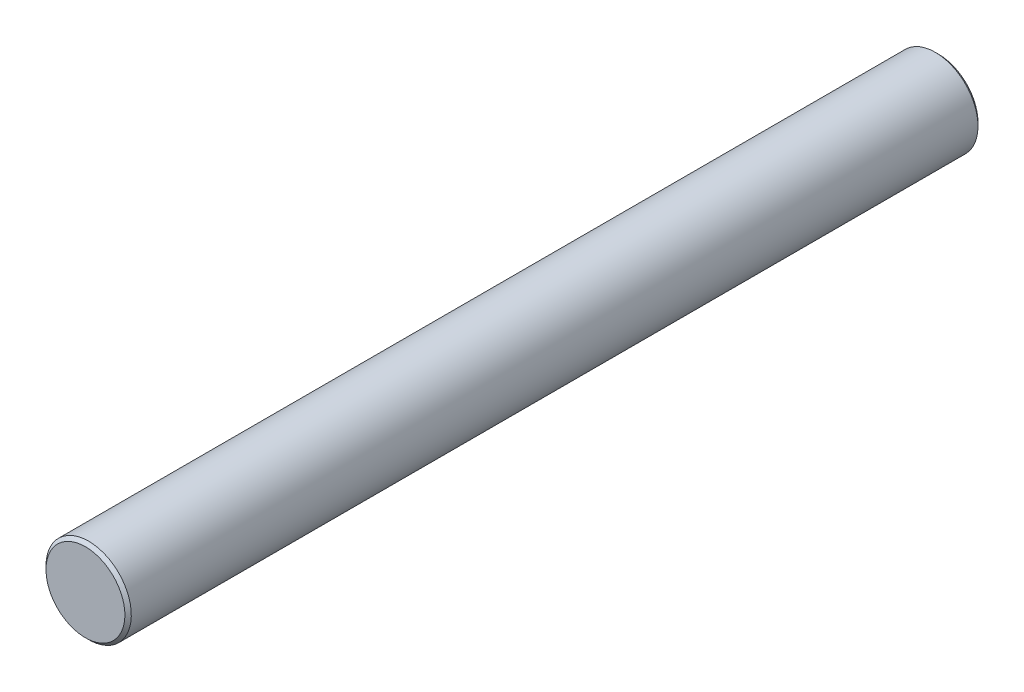
ISO-10303-21;
HEADER;
FILE_DESCRIPTION(('STEP AP214'),'2;1');
FILE_NAME('part.step','',(''),(''),'','','');
FILE_SCHEMA(('AUTOMOTIVE_DESIGN { 1 0 10303 214 1 1 1 1 }'));
ENDSEC;
DATA;
#1=APPLICATION_CONTEXT('core data for automotive mechanical design processes');
#2=APPLICATION_PROTOCOL_DEFINITION('international standard','automotive_design',2000,#1);
#3=PRODUCT_CONTEXT('',#1,'mechanical');
#4=PRODUCT('Part','Part','',(#3));
#5=PRODUCT_RELATED_PRODUCT_CATEGORY('part','',(#4));
#6=PRODUCT_DEFINITION_FORMATION('','',#4);
#7=PRODUCT_DEFINITION_CONTEXT('part definition',#1,'design');
#8=PRODUCT_DEFINITION('design','',#6,#7);
#9=PRODUCT_DEFINITION_SHAPE('','',#8);
#10=(LENGTH_UNIT() NAMED_UNIT(*) SI_UNIT(.MILLI.,.METRE.));
#11=(NAMED_UNIT(*) PLANE_ANGLE_UNIT() SI_UNIT($,.RADIAN.));
#12=(NAMED_UNIT(*) SI_UNIT($,.STERADIAN.) SOLID_ANGLE_UNIT());
#13=UNCERTAINTY_MEASURE_WITH_UNIT(LENGTH_MEASURE(1.E-05),#10,'distance_accuracy_value','');
#14=(GEOMETRIC_REPRESENTATION_CONTEXT(3) GLOBAL_UNCERTAINTY_ASSIGNED_CONTEXT((#13)) GLOBAL_UNIT_ASSIGNED_CONTEXT((#10,
#11,#12)) REPRESENTATION_CONTEXT('',''));
#15=CARTESIAN_POINT('',(0.,0.,0.));
#16=DIRECTION('',(0.,0.,1.));
#17=DIRECTION('',(1.,0.,0.));
#18=AXIS2_PLACEMENT_3D('',#15,#16,#17);
#19=CARTESIAN_POINT('',(0.,9.25,0.));
#20=DIRECTION('',(0.,0.,-1.));
#21=DIRECTION('',(0.,1.,0.));
#22=AXIS2_PLACEMENT_3D('',#19,#20,#21);
#23=PLANE('',#22);
#24=CARTESIAN_POINT('',(0.,0.,0.));
#25=DIRECTION('',(0.,0.,-1.));
#26=DIRECTION('',(0.,1.,0.));
#27=AXIS2_PLACEMENT_3D('',#24,#25,#26);
#28=CIRCLE('',#27,18.5);
#29=CARTESIAN_POINT('',(0.,18.5,0.));
#30=VERTEX_POINT('',#29);
#31=EDGE_CURVE('E9',#30,#30,#28,.T.);
#32=ORIENTED_EDGE('',*,*,#31,.T.);
#33=EDGE_LOOP('',(#32));
#34=FACE_BOUND('',#33,.T.);
#35=CARTESIAN_POINT('',(0.,0.,0.));
#36=DIRECTION('',(0.,0.,1.));
#37=DIRECTION('',(-1.,0.,0.));
#38=AXIS2_PLACEMENT_3D('',#35,#36,#37);
#39=CIRCLE('',#38,6.);
#40=CARTESIAN_POINT('',(-6.,0.,0.));
#41=VERTEX_POINT('',#40);
#42=EDGE_CURVE('E69',#41,#41,#39,.T.);
#43=ORIENTED_EDGE('',*,*,#42,.T.);
#44=EDGE_LOOP('',(#43));
#45=FACE_BOUND('',#44,.T.);
#46=ADVANCED_FACE('F15',(#34,#45),#23,.T.);
#47=CARTESIAN_POINT('',(0.,0.,0.75));
#48=DIRECTION('',(0.,0.,1.));
#49=DIRECTION('',(0.,1.,0.));
#50=AXIS2_PLACEMENT_3D('',#47,#48,#49);
#51=CONICAL_SURFACE('',#50,19.25,0.785398163397448);
#52=CARTESIAN_POINT('',(0.,0.,1.5));
#53=DIRECTION('',(0.,0.,-1.));
#54=DIRECTION('',(0.,1.,0.));
#55=AXIS2_PLACEMENT_3D('',#52,#53,#54);
#56=CIRCLE('',#55,20.);
#57=CARTESIAN_POINT('',(0.,20.,1.5));
#58=VERTEX_POINT('',#57);
#59=EDGE_CURVE('E24',#58,#58,#56,.T.);
#60=ORIENTED_EDGE('',*,*,#59,.T.);
#61=EDGE_LOOP('',(#60));
#62=FACE_BOUND('',#61,.T.);
#63=ORIENTED_EDGE('',*,*,#31,.F.);
#64=EDGE_LOOP('',(#63));
#65=FACE_BOUND('',#64,.T.);
#66=ADVANCED_FACE('F113',(#62,#65),#51,.T.);
#67=CARTESIAN_POINT('',(0.,0.,200.));
#68=DIRECTION('',(0.,0.,1.));
#69=DIRECTION('',(0.,1.,0.));
#70=AXIS2_PLACEMENT_3D('',#67,#68,#69);
#71=CYLINDRICAL_SURFACE('',#70,20.);
#72=CARTESIAN_POINT('',(0.,0.,398.5));
#73=DIRECTION('',(0.,0.,-1.));
#74=DIRECTION('',(0.,1.,0.));
#75=AXIS2_PLACEMENT_3D('',#72,#73,#74);
#76=CIRCLE('',#75,20.);
#77=CARTESIAN_POINT('',(0.,20.,398.5));
#78=VERTEX_POINT('',#77);
#79=EDGE_CURVE('E19',#78,#78,#76,.T.);
#80=ORIENTED_EDGE('',*,*,#79,.T.);
#81=EDGE_LOOP('',(#80));
#82=FACE_BOUND('',#81,.T.);
#83=ORIENTED_EDGE('',*,*,#59,.F.);
#84=EDGE_LOOP('',(#83));
#85=FACE_BOUND('',#84,.T.);
#86=CARTESIAN_POINT('',(0.,0.,6.5));
#87=DIRECTION('',(0.,0.,-1.));
#88=DIRECTION('',(0.,1.,0.));
#89=AXIS2_PLACEMENT_3D('',#86,#87,#88);
#90=CIRCLE('',#89,20.);
#91=CARTESIAN_POINT('',(10.5356537528527,-17.,6.5));
#92=VERTEX_POINT('',#91);
#93=CARTESIAN_POINT('',(-10.5356537528527,-17.,6.5));
#94=VERTEX_POINT('',#93);
#95=EDGE_CURVE('E82',#92,#94,#90,.T.);
#96=ORIENTED_EDGE('',*,*,#95,.T.);
#97=DIRECTION('',(0.,0.,1.));
#98=VECTOR('',#97,1.);
#99=CARTESIAN_POINT('',(-10.5356537528527,-17.,8.25));
#100=LINE('',#99,#98);
#101=CARTESIAN_POINT('',(-10.5356537528527,-17.,10.));
#102=VERTEX_POINT('',#101);
#103=EDGE_CURVE('E76',#94,#102,#100,.T.);
#104=ORIENTED_EDGE('',*,*,#103,.T.);
#105=CARTESIAN_POINT('',(0.,0.,10.));
#106=DIRECTION('',(0.,0.,1.));
#107=DIRECTION('',(0.,1.,0.));
#108=AXIS2_PLACEMENT_3D('',#105,#106,#107);
#109=CIRCLE('',#108,20.);
#110=CARTESIAN_POINT('',(10.5356537528527,-17.,10.));
#111=VERTEX_POINT('',#110);
#112=EDGE_CURVE('E88',#102,#111,#109,.T.);
#113=ORIENTED_EDGE('',*,*,#112,.T.);
#114=DIRECTION('',(0.,0.,-1.));
#115=VECTOR('',#114,1.);
#116=CARTESIAN_POINT('',(10.5356537528527,-17.,8.25));
#117=LINE('',#116,#115);
#118=EDGE_CURVE('E75',#111,#92,#117,.T.);
#119=ORIENTED_EDGE('',*,*,#118,.T.);
#120=EDGE_LOOP('',(#96,#104,#113,#119));
#121=FACE_BOUND('',#120,.T.);
#122=ADVANCED_FACE('F17',(#82,#85,#121),#71,.T.);
#123=CARTESIAN_POINT('',(0.,0.,399.25));
#124=DIRECTION('',(0.,0.,-1.));
#125=DIRECTION('',(0.,1.,0.));
#126=AXIS2_PLACEMENT_3D('',#123,#124,#125);
#127=CONICAL_SURFACE('',#126,19.25,0.785398163397448);
#128=CARTESIAN_POINT('',(0.,0.,400.));
#129=DIRECTION('',(0.,0.,-1.));
#130=DIRECTION('',(0.,1.,0.));
#131=AXIS2_PLACEMENT_3D('',#128,#129,#130);
#132=CIRCLE('',#131,18.5);
#133=CARTESIAN_POINT('',(0.,18.5,400.));
#134=VERTEX_POINT('',#133);
#135=EDGE_CURVE('E64',#134,#134,#132,.T.);
#136=ORIENTED_EDGE('',*,*,#135,.T.);
#137=EDGE_LOOP('',(#136));
#138=FACE_BOUND('',#137,.T.);
#139=ORIENTED_EDGE('',*,*,#79,.F.);
#140=EDGE_LOOP('',(#139));
#141=FACE_BOUND('',#140,.T.);
#142=ADVANCED_FACE('F65',(#138,#141),#127,.T.);
#143=CARTESIAN_POINT('',(0.,9.25,400.));
#144=DIRECTION('',(0.,0.,1.));
#145=DIRECTION('',(0.,-1.,0.));
#146=AXIS2_PLACEMENT_3D('',#143,#144,#145);
#147=PLANE('',#146);
#148=ORIENTED_EDGE('',*,*,#135,.F.);
#149=EDGE_LOOP('',(#148));
#150=FACE_BOUND('',#149,.T.);
#151=ADVANCED_FACE('F122',(#150),#147,.T.);
#152=CARTESIAN_POINT('',(0.,0.,26.4586213285198));
#153=DIRECTION('',(0.,0.,-1.));
#154=DIRECTION('',(-1.,0.,0.));
#155=AXIS2_PLACEMENT_3D('',#152,#153,#154);
#156=CONICAL_SURFACE('',#155,2.52640625,1.0471975511966);
#157=CARTESIAN_POINT('',(0.,0.,25.));
#158=DIRECTION('',(0.,0.,1.));
#159=DIRECTION('',(-1.,0.,0.));
#160=AXIS2_PLACEMENT_3D('',#157,#158,#159);
#161=CIRCLE('',#160,5.0528125);
#162=CARTESIAN_POINT('',(-5.0528125,0.,25.));
#163=VERTEX_POINT('',#162);
#164=EDGE_CURVE('E68',#163,#163,#161,.T.);
#165=ORIENTED_EDGE('',*,*,#164,.F.);
#166=EDGE_LOOP('',(#165));
#167=FACE_BOUND('',#166,.T.);
#168=CARTESIAN_POINT('',(0.,0.,27.9172426570397));
#169=VERTEX_POINT('',#168);
#170=VERTEX_LOOP('',#169);
#171=FACE_BOUND('',#170,.T.);
#172=ADVANCED_FACE('F125',(#167,#171),#156,.F.);
#173=CARTESIAN_POINT('',(0.,0.,12.97359375));
#174=DIRECTION('',(0.,0.,-1.));
#175=DIRECTION('',(-1.,0.,0.));
#176=AXIS2_PLACEMENT_3D('',#173,#174,#175);
#177=CYLINDRICAL_SURFACE('',#176,5.0528125);
#178=CARTESIAN_POINT('',(0.,0.,0.9471875));
#179=DIRECTION('',(0.,0.,1.));
#180=DIRECTION('',(-1.,0.,0.));
#181=AXIS2_PLACEMENT_3D('',#178,#179,#180);
#182=CIRCLE('',#181,5.0528125);
#183=CARTESIAN_POINT('',(-5.0528125,0.,0.9471875));
#184=VERTEX_POINT('',#183);
#185=EDGE_CURVE('E73',#184,#184,#182,.T.);
#186=ORIENTED_EDGE('',*,*,#185,.F.);
#187=EDGE_LOOP('',(#186));
#188=FACE_BOUND('',#187,.T.);
#189=ORIENTED_EDGE('',*,*,#164,.T.);
#190=EDGE_LOOP('',(#189));
#191=FACE_BOUND('',#190,.T.);
#192=ADVANCED_FACE('F128',(#188,#191),#177,.F.);
#193=CARTESIAN_POINT('',(0.,0.,0.47359375));
#194=DIRECTION('',(0.,0.,-1.));
#195=DIRECTION('',(-1.,0.,0.));
#196=AXIS2_PLACEMENT_3D('',#193,#194,#195);
#197=CONICAL_SURFACE('',#196,5.52640625,0.785398163397448);
#198=ORIENTED_EDGE('',*,*,#42,.F.);
#199=EDGE_LOOP('',(#198));
#200=FACE_BOUND('',#199,.T.);
#201=ORIENTED_EDGE('',*,*,#185,.T.);
#202=EDGE_LOOP('',(#201));
#203=FACE_BOUND('',#202,.T.);
#204=ADVANCED_FACE('F110',(#200,#203),#197,.F.);
#205=CARTESIAN_POINT('',(0.,-17.,8.25));
#206=DIRECTION('',(0.,-1.,0.));
#207=DIRECTION('',(0.,0.,-1.));
#208=AXIS2_PLACEMENT_3D('',#205,#206,#207);
#209=PLANE('',#208);
#210=ORIENTED_EDGE('',*,*,#103,.F.);
#211=DIRECTION('',(1.,0.,0.));
#212=VECTOR('',#211,1.);
#213=CARTESIAN_POINT('',(0.,-17.,6.5));
#214=LINE('',#213,#212);
#215=EDGE_CURVE('E79',#94,#92,#214,.T.);
#216=ORIENTED_EDGE('',*,*,#215,.T.);
#217=ORIENTED_EDGE('',*,*,#118,.F.);
#218=DIRECTION('',(-1.,0.,0.));
#219=VECTOR('',#218,1.);
#220=CARTESIAN_POINT('',(0.,-17.,10.));
#221=LINE('',#220,#219);
#222=EDGE_CURVE('E85',#111,#102,#221,.T.);
#223=ORIENTED_EDGE('',*,*,#222,.T.);
#224=EDGE_LOOP('',(#210,#216,#217,#223));
#225=FACE_BOUND('',#224,.T.);
#226=ADVANCED_FACE('F97',(#225),#209,.T.);
#227=CARTESIAN_POINT('',(0.,-19.5,6.5));
#228=DIRECTION('',(0.,0.,1.));
#229=DIRECTION('',(1.,0.,0.));
#230=AXIS2_PLACEMENT_3D('',#227,#228,#229);
#231=PLANE('',#230);
#232=ORIENTED_EDGE('',*,*,#95,.F.);
#233=ORIENTED_EDGE('',*,*,#215,.F.);
#234=EDGE_LOOP('',(#232,#233));
#235=FACE_BOUND('',#234,.T.);
#236=ADVANCED_FACE('F101',(#235),#231,.T.);
#237=CARTESIAN_POINT('',(0.,-19.5,10.));
#238=DIRECTION('',(0.,0.,1.));
#239=DIRECTION('',(1.,0.,0.));
#240=AXIS2_PLACEMENT_3D('',#237,#238,#239);
#241=PLANE('',#240);
#242=ORIENTED_EDGE('',*,*,#112,.F.);
#243=ORIENTED_EDGE('',*,*,#222,.F.);
#244=EDGE_LOOP('',(#242,#243));
#245=FACE_BOUND('',#244,.T.);
#246=ADVANCED_FACE('F95',(#245),#241,.F.);
#247=CLOSED_SHELL('',(#46,#66,#122,#142,#151,#172,#192,#204,#226,#236,#246));
#248=MANIFOLD_SOLID_BREP('B1',#247);
#249=ADVANCED_BREP_SHAPE_REPRESENTATION('',(#18,#248),#14);
#250=SHAPE_DEFINITION_REPRESENTATION(#9,#249);
ENDSEC;
END-ISO-10303-21;
